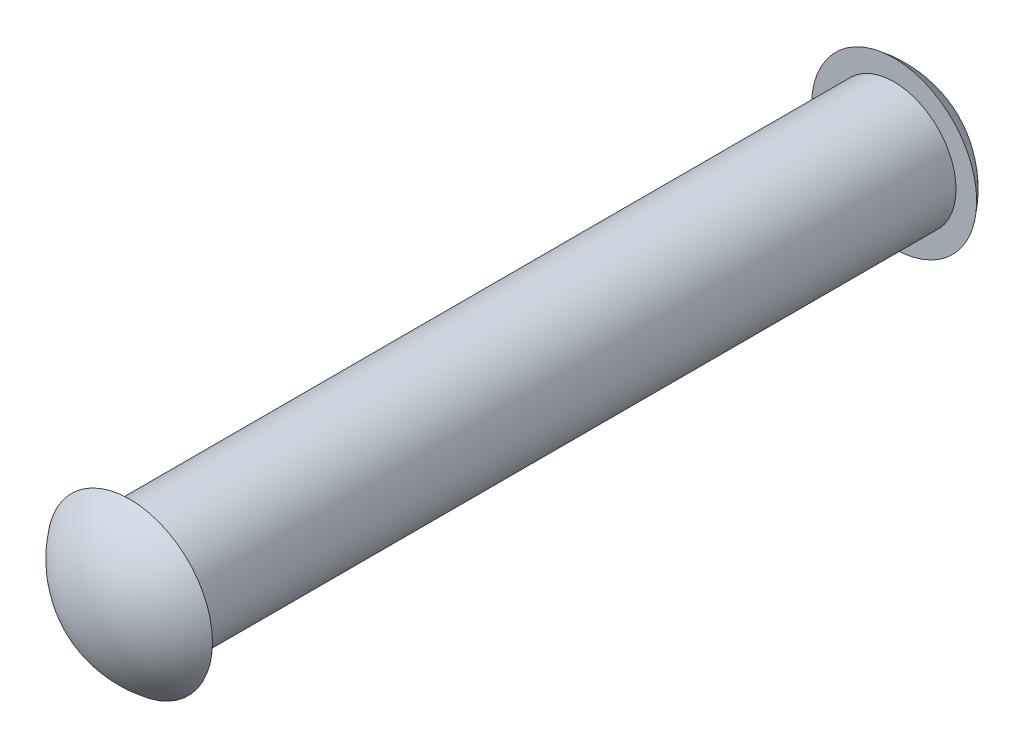
ISO-10303-21;
HEADER;
FILE_DESCRIPTION(('STEP AP214'),'2;1');
FILE_NAME('part.step','',(''),(''),'','','');
FILE_SCHEMA(('AUTOMOTIVE_DESIGN { 1 0 10303 214 1 1 1 1 }'));
ENDSEC;
DATA;
#1=APPLICATION_CONTEXT('core data for automotive mechanical design processes');
#2=APPLICATION_PROTOCOL_DEFINITION('international standard','automotive_design',2000,#1);
#3=PRODUCT_CONTEXT('',#1,'mechanical');
#4=PRODUCT('Part','Part','',(#3));
#5=PRODUCT_RELATED_PRODUCT_CATEGORY('part','',(#4));
#6=PRODUCT_DEFINITION_FORMATION('','',#4);
#7=PRODUCT_DEFINITION_CONTEXT('part definition',#1,'design');
#8=PRODUCT_DEFINITION('design','',#6,#7);
#9=PRODUCT_DEFINITION_SHAPE('','',#8);
#10=(LENGTH_UNIT() NAMED_UNIT(*) SI_UNIT(.MILLI.,.METRE.));
#11=(NAMED_UNIT(*) PLANE_ANGLE_UNIT() SI_UNIT($,.RADIAN.));
#12=(NAMED_UNIT(*) SI_UNIT($,.STERADIAN.) SOLID_ANGLE_UNIT());
#13=UNCERTAINTY_MEASURE_WITH_UNIT(LENGTH_MEASURE(1.E-05),#10,'distance_accuracy_value','');
#14=(GEOMETRIC_REPRESENTATION_CONTEXT(3) GLOBAL_UNCERTAINTY_ASSIGNED_CONTEXT((#13)) GLOBAL_UNIT_ASSIGNED_CONTEXT((#10,
#11,#12)) REPRESENTATION_CONTEXT('',''));
#15=CARTESIAN_POINT('',(0.,0.,0.));
#16=DIRECTION('',(0.,0.,1.));
#17=DIRECTION('',(1.,0.,0.));
#18=AXIS2_PLACEMENT_3D('',#15,#16,#17);
#19=CARTESIAN_POINT('',(31.8301270189222,0.,-45.4852813742386));
#20=DIRECTION('',(0.,0.,1.));
#21=DIRECTION('',(1.,0.,0.));
#22=AXIS2_PLACEMENT_3D('',#19,#20,#21);
#23=CYLINDRICAL_SURFACE('',#22,3.);
#24=CARTESIAN_POINT('',(31.8301270189222,0.,-37.));
#25=DIRECTION('',(0.,0.,1.));
#26=DIRECTION('',(1.,0.,0.));
#27=AXIS2_PLACEMENT_3D('',#24,#25,#26);
#28=CIRCLE('',#27,3.);
#29=CARTESIAN_POINT('',(34.8301270189222,0.,-37.));
#30=VERTEX_POINT('',#29);
#31=EDGE_CURVE('E10',#30,#30,#28,.F.);
#32=CARTESIAN_POINT('',(31.8301270189222,0.,0.));
#33=DIRECTION('',(0.,0.,1.));
#34=DIRECTION('',(1.,0.,0.));
#35=AXIS2_PLACEMENT_3D('',#32,#33,#34);
#36=CIRCLE('',#35,3.);
#37=CARTESIAN_POINT('',(34.8301270189222,0.,0.));
#38=VERTEX_POINT('',#37);
#39=EDGE_CURVE('E38',#38,#38,#36,.T.);
#40=CARTESIAN_POINT('',(34.8301270189222,0.,-37.));
#41=CARTESIAN_POINT('',(34.8301270189222,0.,-36.6145833333333));
#42=CARTESIAN_POINT('',(34.8301270189222,0.,-36.2291666666666));
#43=CARTESIAN_POINT('',(34.8301270189222,0.,-35.4583333333333));
#44=CARTESIAN_POINT('',(34.8301270189222,0.,-35.0729166666667));
#45=CARTESIAN_POINT('',(34.8301270189222,0.,-34.3020833333333));
#46=CARTESIAN_POINT('',(34.8301270189222,0.,-33.9166666666667));
#47=CARTESIAN_POINT('',(34.8301270189222,0.,-33.1458333333333));
#48=CARTESIAN_POINT('',(34.8301270189222,0.,-32.7604166666667));
#49=CARTESIAN_POINT('',(34.8301270189222,0.,-31.9895833333333));
#50=CARTESIAN_POINT('',(34.8301270189222,0.,-31.6041666666667));
#51=CARTESIAN_POINT('',(34.8301270189222,0.,-30.8333333333333));
#52=CARTESIAN_POINT('',(34.8301270189222,0.,-30.4479166666667));
#53=CARTESIAN_POINT('',(34.8301270189222,0.,-29.6770833333333));
#54=CARTESIAN_POINT('',(34.8301270189222,0.,-29.2916666666667));
#55=CARTESIAN_POINT('',(34.8301270189222,0.,-28.5208333333333));
#56=CARTESIAN_POINT('',(34.8301270189222,0.,-28.1354166666667));
#57=CARTESIAN_POINT('',(34.8301270189222,0.,-27.3645833333333));
#58=CARTESIAN_POINT('',(34.8301270189222,0.,-26.9791666666667));
#59=CARTESIAN_POINT('',(34.8301270189222,0.,-26.2083333333333));
#60=CARTESIAN_POINT('',(34.8301270189222,0.,-25.8229166666667));
#61=CARTESIAN_POINT('',(34.8301270189222,0.,-25.0520833333333));
#62=CARTESIAN_POINT('',(34.8301270189222,0.,-24.6666666666667));
#63=CARTESIAN_POINT('',(34.8301270189222,0.,-23.8958333333333));
#64=CARTESIAN_POINT('',(34.8301270189222,0.,-23.5104166666667));
#65=CARTESIAN_POINT('',(34.8301270189222,0.,-22.7395833333333));
#66=CARTESIAN_POINT('',(34.8301270189222,0.,-22.3541666666667));
#67=CARTESIAN_POINT('',(34.8301270189222,0.,-21.5833333333333));
#68=CARTESIAN_POINT('',(34.8301270189222,0.,-21.1979166666667));
#69=CARTESIAN_POINT('',(34.8301270189222,0.,-20.4270833333333));
#70=CARTESIAN_POINT('',(34.8301270189222,0.,-20.0416666666667));
#71=CARTESIAN_POINT('',(34.8301270189222,0.,-19.2708333333333));
#72=CARTESIAN_POINT('',(34.8301270189222,0.,-18.8854166666667));
#73=CARTESIAN_POINT('',(34.8301270189222,0.,-18.1145833333333));
#74=CARTESIAN_POINT('',(34.8301270189222,0.,-17.7291666666667));
#75=CARTESIAN_POINT('',(34.8301270189222,0.,-16.9583333333333));
#76=CARTESIAN_POINT('',(34.8301270189222,0.,-16.5729166666667));
#77=CARTESIAN_POINT('',(34.8301270189222,0.,-15.8020833333333));
#78=CARTESIAN_POINT('',(34.8301270189222,0.,-15.4166666666667));
#79=CARTESIAN_POINT('',(34.8301270189222,0.,-14.6458333333333));
#80=CARTESIAN_POINT('',(34.8301270189222,0.,-14.2604166666667));
#81=CARTESIAN_POINT('',(34.8301270189222,0.,-13.4895833333333));
#82=CARTESIAN_POINT('',(34.8301270189222,0.,-13.1041666666667));
#83=CARTESIAN_POINT('',(34.8301270189222,0.,-12.3333333333333));
#84=CARTESIAN_POINT('',(34.8301270189222,0.,-11.9479166666667));
#85=CARTESIAN_POINT('',(34.8301270189222,0.,-11.1770833333333));
#86=CARTESIAN_POINT('',(34.8301270189222,0.,-10.7916666666667));
#87=CARTESIAN_POINT('',(34.8301270189222,0.,-10.0208333333333));
#88=CARTESIAN_POINT('',(34.8301270189222,0.,-9.63541666666667));
#89=CARTESIAN_POINT('',(34.8301270189222,0.,-8.86458333333334));
#90=CARTESIAN_POINT('',(34.8301270189222,0.,-8.47916666666667));
#91=CARTESIAN_POINT('',(34.8301270189222,0.,-7.70833333333334));
#92=CARTESIAN_POINT('',(34.8301270189222,0.,-7.32291666666667));
#93=CARTESIAN_POINT('',(34.8301270189222,0.,-6.55208333333334));
#94=CARTESIAN_POINT('',(34.8301270189222,0.,-6.16666666666667));
#95=CARTESIAN_POINT('',(34.8301270189222,0.,-5.39583333333334));
#96=CARTESIAN_POINT('',(34.8301270189222,0.,-5.01041666666668));
#97=CARTESIAN_POINT('',(34.8301270189222,0.,-4.23958333333335));
#98=CARTESIAN_POINT('',(34.8301270189222,0.,-3.85416666666668));
#99=CARTESIAN_POINT('',(34.8301270189222,0.,-3.08333333333334));
#100=CARTESIAN_POINT('',(34.8301270189222,0.,-2.69791666666667));
#101=CARTESIAN_POINT('',(34.8301270189222,0.,-1.92708333333334));
#102=CARTESIAN_POINT('',(34.8301270189222,0.,-1.54166666666667));
#103=CARTESIAN_POINT('',(34.8301270189222,0.,-0.770833333333338));
#104=CARTESIAN_POINT('',(34.8301270189222,0.,-0.385416666666672));
#105=CARTESIAN_POINT('',(34.8301270189222,0.,0.));
#106=B_SPLINE_CURVE_WITH_KNOTS('',3,(#40,#41,#42,#43,#44,#45,#46,#47,#48,#49,#50,#51,#52,#53,
#54,#55,#56,#57,#58,#59,#60,#61,#62,#63,#64,#65,#66,#67,#68,#69,#70,#71,#72,#73,#74,#75,#76,#77,
#78,#79,#80,#81,#82,#83,#84,#85,#86,#87,#88,#89,#90,#91,#92,#93,#94,#95,#96,#97,#98,#99,#100,
#101,#102,#103,#104,#105),.UNSPECIFIED.,.F.,.F.,(4,2,2,2,2,2,2,2,2,2,2,2,2,2,2,2,2,2,2,2,2,2,2,
2,2,2,2,2,2,2,2,2,4),(0.,1.15625,2.3125,3.46875,4.625,5.78125,6.9375,8.09374999999999,
9.24999999999999,10.40625,11.5625,12.71875,13.875,15.03125,16.1875,17.34375,18.5,19.65625,
20.8125,21.96875,23.125,24.28125,25.4375,26.59375,27.75,28.90625,30.0625,31.21875,32.375,
33.53125,34.6875,35.84375,37.),.UNSPECIFIED.);
#107=EDGE_CURVE('BSEAM32',#30,#38,#106,.T.);
#108=ORIENTED_EDGE('',*,*,#31,.F.);
#109=ORIENTED_EDGE('',*,*,#39,.F.);
#110=ORIENTED_EDGE('',*,*,#107,.T.);
#111=ORIENTED_EDGE('',*,*,#107,.F.);
#112=EDGE_LOOP('',(#108,#110,#109,#111));
#113=FACE_BOUND('',#112,.T.);
#114=ADVANCED_FACE('F32',(#113),#23,.T.);
#115=CARTESIAN_POINT('',(35.8301270189222,0.,0.));
#116=DIRECTION('',(0.,0.,1.));
#117=DIRECTION('',(1.,0.,0.));
#118=AXIS2_PLACEMENT_3D('',#115,#116,#117);
#119=PLANE('',#118);
#120=ORIENTED_EDGE('',*,*,#39,.T.);
#121=EDGE_LOOP('',(#120));
#122=FACE_BOUND('',#121,.T.);
#123=CARTESIAN_POINT('',(31.8301270189222,0.,0.));
#124=DIRECTION('',(0.,0.,-1.));
#125=DIRECTION('',(-1.,0.,0.));
#126=AXIS2_PLACEMENT_3D('',#123,#124,#125);
#127=CIRCLE('',#126,4.);
#128=CARTESIAN_POINT('',(27.8301270189222,0.,0.));
#129=VERTEX_POINT('',#128);
#130=EDGE_CURVE('E42',#129,#129,#127,.T.);
#131=ORIENTED_EDGE('',*,*,#130,.T.);
#132=EDGE_LOOP('',(#131));
#133=FACE_BOUND('',#132,.T.);
#134=ADVANCED_FACE('F63',(#122,#133),#119,.F.);
#135=CARTESIAN_POINT('',(31.8301270189222,0.,-2.99999999999999));
#136=DIRECTION('',(0.,0.,-1.));
#137=DIRECTION('',(1.,0.,0.));
#138=AXIS2_PLACEMENT_3D('',#135,#136,#137);
#139=SPHERICAL_SURFACE('',#138,4.99999999999999);
#140=ORIENTED_EDGE('',*,*,#130,.F.);
#141=EDGE_LOOP('',(#140));
#142=FACE_BOUND('',#141,.T.);
#143=ADVANCED_FACE('F56',(#142),#139,.T.);
#144=CARTESIAN_POINT('',(35.8301270189222,0.,-37.));
#145=DIRECTION('',(0.,0.,-1.));
#146=DIRECTION('',(1.,0.,0.));
#147=AXIS2_PLACEMENT_3D('',#144,#145,#146);
#148=PLANE('',#147);
#149=ORIENTED_EDGE('',*,*,#31,.T.);
#150=EDGE_LOOP('',(#149));
#151=FACE_BOUND('',#150,.T.);
#152=CARTESIAN_POINT('',(31.8301270189222,0.,-37.));
#153=DIRECTION('',(0.,0.,-1.));
#154=DIRECTION('',(-1.,0.,0.));
#155=AXIS2_PLACEMENT_3D('',#152,#153,#154);
#156=CIRCLE('',#155,4.);
#157=CARTESIAN_POINT('',(27.8301270189222,0.,-37.));
#158=VERTEX_POINT('',#157);
#159=EDGE_CURVE('E46',#158,#158,#156,.T.);
#160=ORIENTED_EDGE('',*,*,#159,.F.);
#161=EDGE_LOOP('',(#160));
#162=FACE_BOUND('',#161,.T.);
#163=ADVANCED_FACE('F54',(#151,#162),#148,.F.);
#164=CARTESIAN_POINT('',(31.8301270189222,0.,-34.));
#165=DIRECTION('',(0.,0.,1.));
#166=DIRECTION('',(1.,0.,0.));
#167=AXIS2_PLACEMENT_3D('',#164,#165,#166);
#168=SPHERICAL_SURFACE('',#167,4.99999999999999);
#169=ORIENTED_EDGE('',*,*,#159,.T.);
#170=EDGE_LOOP('',(#169));
#171=FACE_BOUND('',#170,.T.);
#172=ADVANCED_FACE('F52',(#171),#168,.T.);
#173=CLOSED_SHELL('',(#114,#134,#143,#163,#172));
#174=MANIFOLD_SOLID_BREP('B2',#173);
#175=ADVANCED_BREP_SHAPE_REPRESENTATION('',(#18,#174),#14);
#176=SHAPE_DEFINITION_REPRESENTATION(#9,#175);
ENDSEC;
END-ISO-10303-21;
